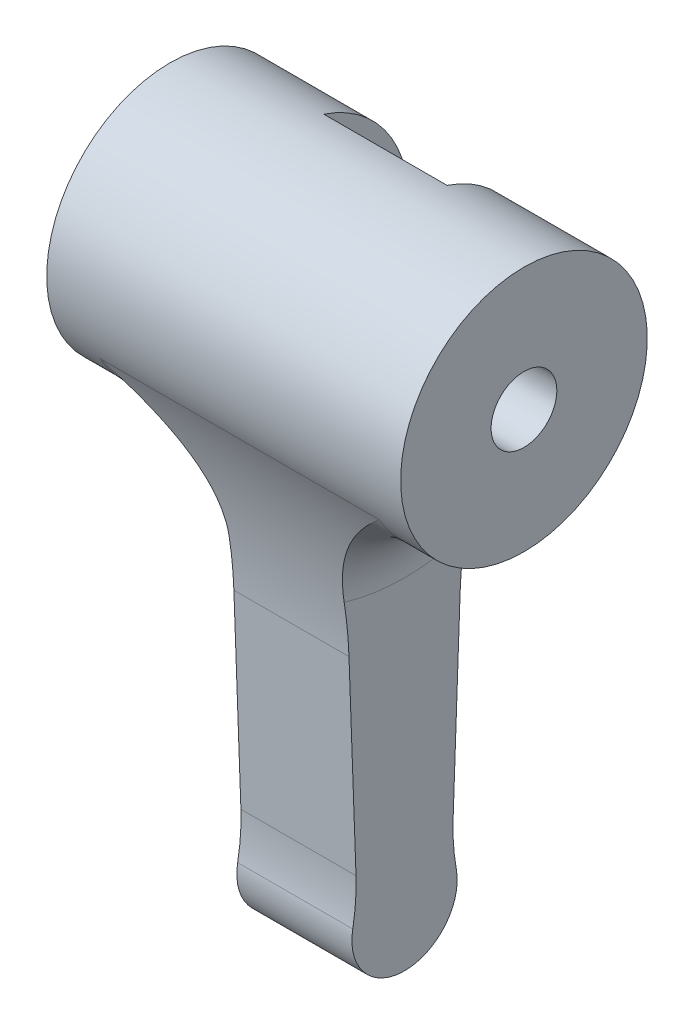
ISO-10303-21;
HEADER;
FILE_DESCRIPTION(('STEP AP214'),'2;1');
FILE_NAME('part.step','',(''),(''),'','','');
FILE_SCHEMA(('AUTOMOTIVE_DESIGN { 1 0 10303 214 1 1 1 1 }'));
ENDSEC;
DATA;
#1=APPLICATION_CONTEXT('core data for automotive mechanical design processes');
#2=APPLICATION_PROTOCOL_DEFINITION('international standard','automotive_design',2000,#1);
#3=PRODUCT_CONTEXT('',#1,'mechanical');
#4=PRODUCT('Part','Part','',(#3));
#5=PRODUCT_RELATED_PRODUCT_CATEGORY('part','',(#4));
#6=PRODUCT_DEFINITION_FORMATION('','',#4);
#7=PRODUCT_DEFINITION_CONTEXT('part definition',#1,'design');
#8=PRODUCT_DEFINITION('design','',#6,#7);
#9=PRODUCT_DEFINITION_SHAPE('','',#8);
#10=(LENGTH_UNIT() NAMED_UNIT(*) SI_UNIT(.MILLI.,.METRE.));
#11=(NAMED_UNIT(*) PLANE_ANGLE_UNIT() SI_UNIT($,.RADIAN.));
#12=(NAMED_UNIT(*) SI_UNIT($,.STERADIAN.) SOLID_ANGLE_UNIT());
#13=UNCERTAINTY_MEASURE_WITH_UNIT(LENGTH_MEASURE(1.E-05),#10,'distance_accuracy_value','');
#14=(GEOMETRIC_REPRESENTATION_CONTEXT(3) GLOBAL_UNCERTAINTY_ASSIGNED_CONTEXT((#13)) GLOBAL_UNIT_ASSIGNED_CONTEXT((#10,
#11,#12)) REPRESENTATION_CONTEXT('',''));
#15=CARTESIAN_POINT('',(0.,0.,0.));
#16=DIRECTION('',(0.,0.,1.));
#17=DIRECTION('',(1.,0.,0.));
#18=AXIS2_PLACEMENT_3D('',#15,#16,#17);
#19=CARTESIAN_POINT('',(-1.4,0.,0.));
#20=DIRECTION('',(1.,0.,0.));
#21=DIRECTION('',(0.,0.,-1.));
#22=AXIS2_PLACEMENT_3D('',#19,#20,#21);
#23=PLANE('',#22);
#24=CARTESIAN_POINT('',(-1.4,5.65271213373792,11.3451283264141));
#25=DIRECTION('',(-1.,0.,0.));
#26=DIRECTION('',(0.,0.,-1.));
#27=AXIS2_PLACEMENT_3D('',#24,#25,#26);
#28=CIRCLE('',#27,10.);
#29=CARTESIAN_POINT('',(-1.4,7.22060634206259,1.46880776906567));
#30=VERTEX_POINT('',#29);
#31=CARTESIAN_POINT('',(-1.4,6.01587936022863,1.35172502395482));
#32=VERTEX_POINT('',#31);
#33=EDGE_CURVE('E287',#30,#32,#28,.T.);
#34=ORIENTED_EDGE('',*,*,#33,.F.);
#35=CARTESIAN_POINT('',(-1.4,12.,0.));
#36=DIRECTION('',(1.,0.,0.));
#37=DIRECTION('',(0.,0.,-1.));
#38=AXIS2_PLACEMENT_3D('',#35,#36,#37);
#39=CIRCLE('',#38,5.);
#40=CARTESIAN_POINT('',(-1.4,7.22060634206259,-1.46880776906567));
#41=VERTEX_POINT('',#40);
#42=EDGE_CURVE('E354',#30,#41,#39,.T.);
#43=ORIENTED_EDGE('',*,*,#42,.T.);
#44=CARTESIAN_POINT('',(-1.4,5.65271213373792,-11.3451283264141));
#45=DIRECTION('',(-1.,0.,0.));
#46=DIRECTION('',(0.,0.,1.));
#47=AXIS2_PLACEMENT_3D('',#44,#45,#46);
#48=CIRCLE('',#47,10.);
#49=CARTESIAN_POINT('',(-1.4,6.0158793602286,-1.35172502395481));
#50=VERTEX_POINT('',#49);
#51=EDGE_CURVE('E283',#50,#41,#48,.T.);
#52=ORIENTED_EDGE('',*,*,#51,.F.);
#53=DIRECTION('',(0.,0.999340330245923,-0.0363167226490681));
#54=VECTOR('',#53,1.);
#55=CARTESIAN_POINT('',(-1.4,6.0158793602286,-1.35172502395481));
#56=LINE('',#55,#54);
#57=CARTESIAN_POINT('',(-1.4,1.31502149827825,-1.18089257977322));
#58=VERTEX_POINT('',#57);
#59=EDGE_CURVE('E279',#58,#50,#56,.T.);
#60=ORIENTED_EDGE('',*,*,#59,.F.);
#61=CARTESIAN_POINT('',(-1.4,1.13343788503291,-6.17759423100284));
#62=DIRECTION('',(-1.,0.,0.));
#63=DIRECTION('',(0.,0.,1.));
#64=AXIS2_PLACEMENT_3D('',#61,#62,#63);
#65=CIRCLE('',#64,5.);
#66=CARTESIAN_POINT('',(-1.4,0.231121587045055,-1.2596856004582));
#67=VERTEX_POINT('',#66);
#68=EDGE_CURVE('E275',#67,#58,#65,.T.);
#69=ORIENTED_EDGE('',*,*,#68,.F.);
#70=CARTESIAN_POINT('',(-1.4,0.,0.));
#71=DIRECTION('',(1.,0.,0.));
#72=DIRECTION('',(0.,0.,-1.));
#73=AXIS2_PLACEMENT_3D('',#70,#71,#72);
#74=CIRCLE('',#73,1.28071269221475);
#75=CARTESIAN_POINT('',(-1.4,0.231121587045048,1.2596856004582));
#76=VERTEX_POINT('',#75);
#77=EDGE_CURVE('E271',#76,#67,#74,.T.);
#78=ORIENTED_EDGE('',*,*,#77,.F.);
#79=CARTESIAN_POINT('',(-1.4,1.13343788503291,6.17759423100284));
#80=DIRECTION('',(-1.,0.,0.));
#81=DIRECTION('',(0.,0.,-1.));
#82=AXIS2_PLACEMENT_3D('',#79,#80,#81);
#83=CIRCLE('',#82,5.);
#84=CARTESIAN_POINT('',(-1.4,1.31502149827826,1.18089257977323));
#85=VERTEX_POINT('',#84);
#86=EDGE_CURVE('E294',#85,#76,#83,.T.);
#87=ORIENTED_EDGE('',*,*,#86,.F.);
#88=DIRECTION('',(0.,-0.999340330245923,-0.0363167226490693));
#89=VECTOR('',#88,1.);
#90=CARTESIAN_POINT('',(-1.4,6.01587936022863,1.35172502395482));
#91=LINE('',#90,#89);
#92=EDGE_CURVE('E290',#32,#85,#91,.T.);
#93=ORIENTED_EDGE('',*,*,#92,.F.);
#94=EDGE_LOOP('',(#34,#43,#52,#60,#69,#78,#87,#93));
#95=FACE_BOUND('',#94,.T.);
#96=ADVANCED_FACE('F41',(#95),#23,.F.);
#97=CARTESIAN_POINT('',(1.4,0.,0.));
#98=DIRECTION('',(1.,0.,0.));
#99=DIRECTION('',(0.,0.,-1.));
#100=AXIS2_PLACEMENT_3D('',#97,#98,#99);
#101=PLANE('',#100);
#102=CARTESIAN_POINT('',(1.4,5.65271213373792,-11.3451283264141));
#103=DIRECTION('',(-1.,0.,0.));
#104=DIRECTION('',(0.,0.,1.));
#105=AXIS2_PLACEMENT_3D('',#102,#103,#104);
#106=CIRCLE('',#105,10.);
#107=CARTESIAN_POINT('',(1.4,6.0158793602286,-1.35172502395481));
#108=VERTEX_POINT('',#107);
#109=CARTESIAN_POINT('',(1.4,7.22060634206259,-1.46880776906567));
#110=VERTEX_POINT('',#109);
#111=EDGE_CURVE('E256',#108,#110,#106,.T.);
#112=ORIENTED_EDGE('',*,*,#111,.T.);
#113=CARTESIAN_POINT('',(1.4,12.,0.));
#114=DIRECTION('',(1.,0.,0.));
#115=DIRECTION('',(0.,0.,-1.));
#116=AXIS2_PLACEMENT_3D('',#113,#114,#115);
#117=CIRCLE('',#116,5.);
#118=CARTESIAN_POINT('',(1.4,7.22060634206259,1.46880776906567));
#119=VERTEX_POINT('',#118);
#120=EDGE_CURVE('E357',#110,#119,#117,.F.);
#121=ORIENTED_EDGE('',*,*,#120,.T.);
#122=CARTESIAN_POINT('',(1.4,5.65271213373792,11.3451283264141));
#123=DIRECTION('',(-1.,0.,0.));
#124=DIRECTION('',(0.,0.,-1.));
#125=AXIS2_PLACEMENT_3D('',#122,#123,#124);
#126=CIRCLE('',#125,10.);
#127=CARTESIAN_POINT('',(1.4,6.01587936022863,1.35172502395482));
#128=VERTEX_POINT('',#127);
#129=EDGE_CURVE('E260',#119,#128,#126,.T.);
#130=ORIENTED_EDGE('',*,*,#129,.T.);
#131=DIRECTION('',(0.,-0.999340330245923,-0.0363167226490693));
#132=VECTOR('',#131,1.);
#133=CARTESIAN_POINT('',(1.4,6.01587936022863,1.35172502395482));
#134=LINE('',#133,#132);
#135=CARTESIAN_POINT('',(1.4,1.31502149827826,1.18089257977323));
#136=VERTEX_POINT('',#135);
#137=EDGE_CURVE('E263',#128,#136,#134,.T.);
#138=ORIENTED_EDGE('',*,*,#137,.T.);
#139=CARTESIAN_POINT('',(1.4,1.13343788503291,6.17759423100284));
#140=DIRECTION('',(-1.,0.,0.));
#141=DIRECTION('',(0.,0.,-1.));
#142=AXIS2_PLACEMENT_3D('',#139,#140,#141);
#143=CIRCLE('',#142,5.);
#144=CARTESIAN_POINT('',(1.4,0.231121587045048,1.2596856004582));
#145=VERTEX_POINT('',#144);
#146=EDGE_CURVE('E267',#136,#145,#143,.T.);
#147=ORIENTED_EDGE('',*,*,#146,.T.);
#148=CARTESIAN_POINT('',(1.4,0.,0.));
#149=DIRECTION('',(1.,0.,0.));
#150=DIRECTION('',(0.,0.,-1.));
#151=AXIS2_PLACEMENT_3D('',#148,#149,#150);
#152=CIRCLE('',#151,1.28071269221475);
#153=CARTESIAN_POINT('',(1.4,0.231121587045055,-1.2596856004582));
#154=VERTEX_POINT('',#153);
#155=EDGE_CURVE('E244',#145,#154,#152,.T.);
#156=ORIENTED_EDGE('',*,*,#155,.T.);
#157=CARTESIAN_POINT('',(1.4,1.13343788503291,-6.17759423100284));
#158=DIRECTION('',(-1.,0.,0.));
#159=DIRECTION('',(0.,0.,1.));
#160=AXIS2_PLACEMENT_3D('',#157,#158,#159);
#161=CIRCLE('',#160,5.);
#162=CARTESIAN_POINT('',(1.4,1.31502149827825,-1.18089257977322));
#163=VERTEX_POINT('',#162);
#164=EDGE_CURVE('E248',#154,#163,#161,.T.);
#165=ORIENTED_EDGE('',*,*,#164,.T.);
#166=DIRECTION('',(0.,0.999340330245923,-0.0363167226490681));
#167=VECTOR('',#166,1.);
#168=CARTESIAN_POINT('',(1.4,6.0158793602286,-1.35172502395481));
#169=LINE('',#168,#167);
#170=EDGE_CURVE('E252',#163,#108,#169,.T.);
#171=ORIENTED_EDGE('',*,*,#170,.T.);
#172=EDGE_LOOP('',(#112,#121,#130,#138,#147,#156,#165,#171));
#173=FACE_BOUND('',#172,.T.);
#174=ADVANCED_FACE('F416',(#173),#101,.T.);
#175=CARTESIAN_POINT('',(-1.4,0.,0.));
#176=DIRECTION('',(1.,0.,0.));
#177=DIRECTION('',(0.,0.,-1.));
#178=AXIS2_PLACEMENT_3D('',#175,#176,#177);
#179=CYLINDRICAL_SURFACE('',#178,1.28071269221475);
#180=DIRECTION('',(1.,0.,0.));
#181=VECTOR('',#180,1.);
#182=CARTESIAN_POINT('',(-1.4,0.231121587045055,-1.2596856004582));
#183=LINE('',#182,#181);
#184=EDGE_CURVE('E298',#67,#154,#183,.T.);
#185=ORIENTED_EDGE('',*,*,#184,.T.);
#186=ORIENTED_EDGE('',*,*,#155,.F.);
#187=DIRECTION('',(1.,0.,0.));
#188=VECTOR('',#187,1.);
#189=CARTESIAN_POINT('',(-1.4,0.231121587045048,1.2596856004582));
#190=LINE('',#189,#188);
#191=EDGE_CURVE('E299',#76,#145,#190,.T.);
#192=ORIENTED_EDGE('',*,*,#191,.F.);
#193=ORIENTED_EDGE('',*,*,#77,.T.);
#194=EDGE_LOOP('',(#185,#186,#192,#193));
#195=FACE_BOUND('',#194,.T.);
#196=ADVANCED_FACE('F422',(#195),#179,.T.);
#197=CARTESIAN_POINT('',(-1.4,1.13343788503291,6.17759423100284));
#198=DIRECTION('',(1.,0.,0.));
#199=DIRECTION('',(0.,0.,-1.));
#200=AXIS2_PLACEMENT_3D('',#197,#198,#199);
#201=CYLINDRICAL_SURFACE('',#200,5.);
#202=ORIENTED_EDGE('',*,*,#191,.T.);
#203=ORIENTED_EDGE('',*,*,#146,.F.);
#204=DIRECTION('',(1.,0.,0.));
#205=VECTOR('',#204,1.);
#206=CARTESIAN_POINT('',(-1.4,1.31502149827826,1.18089257977323));
#207=LINE('',#206,#205);
#208=EDGE_CURVE('E302',#85,#136,#207,.T.);
#209=ORIENTED_EDGE('',*,*,#208,.F.);
#210=ORIENTED_EDGE('',*,*,#86,.T.);
#211=EDGE_LOOP('',(#202,#203,#209,#210));
#212=FACE_BOUND('',#211,.T.);
#213=ADVANCED_FACE('F430',(#212),#201,.F.);
#214=CARTESIAN_POINT('',(-1.4,6.01587936022863,1.35172502395482));
#215=DIRECTION('',(0.,-0.0363167226490693,0.999340330245923));
#216=DIRECTION('',(0.,-0.999340330245923,-0.0363167226490693));
#217=AXIS2_PLACEMENT_3D('',#214,#215,#216);
#218=PLANE('',#217);
#219=ORIENTED_EDGE('',*,*,#208,.T.);
#220=ORIENTED_EDGE('',*,*,#137,.F.);
#221=DIRECTION('',(1.,0.,0.));
#222=VECTOR('',#221,1.);
#223=CARTESIAN_POINT('',(-1.4,6.01587936022863,1.35172502395482));
#224=LINE('',#223,#222);
#225=EDGE_CURVE('E305',#32,#128,#224,.T.);
#226=ORIENTED_EDGE('',*,*,#225,.F.);
#227=ORIENTED_EDGE('',*,*,#92,.T.);
#228=EDGE_LOOP('',(#219,#220,#226,#227));
#229=FACE_BOUND('',#228,.T.);
#230=ADVANCED_FACE('F433',(#229),#218,.T.);
#231=CARTESIAN_POINT('',(-1.4,5.65271213373792,11.3451283264141));
#232=DIRECTION('',(1.,0.,0.));
#233=DIRECTION('',(0.,0.,-1.));
#234=AXIS2_PLACEMENT_3D('',#231,#232,#233);
#235=CYLINDRICAL_SURFACE('',#234,10.);
#236=ORIENTED_EDGE('',*,*,#225,.T.);
#237=ORIENTED_EDGE('',*,*,#129,.F.);
#238=CARTESIAN_POINT('',(1.4,7.22060634206259,1.46880776906567));
#239=CARTESIAN_POINT('',(1.39998456392854,7.30573187153586,1.48230897744977));
#240=CARTESIAN_POINT('',(1.40449054118551,7.3906006001174,1.4969226042818));
#241=CARTESIAN_POINT('',(1.42174460169429,7.55894375459993,1.52812646952778));
#242=CARTESIAN_POINT('',(1.43447441023312,7.64242085204527,1.54471225895342));
#243=CARTESIAN_POINT('',(1.46713944063035,7.80626506619332,1.57941590879311));
#244=CARTESIAN_POINT('',(1.48696553914181,7.88665989993504,1.59750754298956));
#245=CARTESIAN_POINT('',(1.53305912652209,8.04523894062785,1.63521244577628));
#246=CARTESIAN_POINT('',(1.55933079868567,8.12342167498424,1.65482669689845));
#247=CARTESIAN_POINT('',(1.66806009991315,8.41076535108465,1.73053374783954));
#248=CARTESIAN_POINT('',(1.76895885411697,8.61199493027745,1.79091157244589));
#249=CARTESIAN_POINT('',(1.94158848996649,8.89937446228686,1.88629435995976));
#250=CARTESIAN_POINT('',(2.00294683461814,8.99307783326299,1.91902203031715));
#251=CARTESIAN_POINT('',(2.13138239507497,9.17598348355227,1.98585502891483));
#252=CARTESIAN_POINT('',(2.19845824629666,9.26518682883034,2.0199600274147));
#253=CARTESIAN_POINT('',(2.40005750696951,9.51884800748077,2.12096257750806));
#254=CARTESIAN_POINT('',(2.54043992983547,9.67796157952128,2.18947360675582));
#255=CARTESIAN_POINT('',(2.82977111669265,9.98520405857443,2.33080342910772));
#256=CARTESIAN_POINT('',(2.97870200740079,10.1333545013522,2.40361324275461));
#257=CARTESIAN_POINT('',(3.21692613091237,10.3628740982275,2.5233708503079));
#258=CARTESIAN_POINT('',(3.30518353843747,10.4463229115622,2.56843834774253));
#259=CARTESIAN_POINT('',(3.39563564223604,10.5311495683802,2.61581829241981));
#260=CARTESIAN_POINT('',(3.39781782122276,10.5331956162859,2.61696205577527));
#261=CARTESIAN_POINT('',(3.4,10.5352412616318,2.61810653686478));
#262=B_SPLINE_CURVE_WITH_KNOTS('',3,(#238,#239,#240,#241,#242,#243,#244,#245,#246,#247,#248,
#249,#250,#251,#252,#253,#254,#255,#256,#257,#258,#259,#260,#261),.UNSPECIFIED.,.F.,.F.,(4,2,2,
2,2,2,2,2,2,2,2,4),(0.,0.258326731426767,0.516081383552399,0.770031639543701,1.02414715191671,
1.7188466840079,2.0688078706337,2.41868576548898,3.08677793052319,3.75352080850704,
4.14215670293773,4.15176439248419),.UNSPECIFIED.);
#263=CARTESIAN_POINT('',(3.4,10.5352412616318,2.61810653686478));
#264=VERTEX_POINT('',#263);
#265=EDGE_CURVE('E472',#119,#264,#262,.T.);
#266=ORIENTED_EDGE('',*,*,#265,.T.);
#267=DIRECTION('',(1.,0.,0.));
#268=VECTOR('',#267,1.);
#269=CARTESIAN_POINT('',(-1.4,10.5352412616318,2.61810653686478));
#270=LINE('',#269,#268);
#271=CARTESIAN_POINT('',(-3.4,10.5352412616318,2.61810653686478));
#272=VERTEX_POINT('',#271);
#273=EDGE_CURVE('E309',#272,#264,#270,.T.);
#274=ORIENTED_EDGE('',*,*,#273,.F.);
#275=CARTESIAN_POINT('',(-1.4,7.22060634206259,1.46880776906568));
#276=CARTESIAN_POINT('',(-1.39998456392854,7.30573187153589,1.48230897744978));
#277=CARTESIAN_POINT('',(-1.40449054118552,7.39060060011746,1.49692260428181));
#278=CARTESIAN_POINT('',(-1.4217446016943,7.55894375460005,1.5281264695278));
#279=CARTESIAN_POINT('',(-1.43447441023314,7.64242085204541,1.54471225895345));
#280=CARTESIAN_POINT('',(-1.46713944063039,7.80626506619347,1.57941590879314));
#281=CARTESIAN_POINT('',(-1.48696553914185,7.88665989993515,1.59750754298959));
#282=CARTESIAN_POINT('',(-1.53305912652211,8.0452389406279,1.63521244577629));
#283=CARTESIAN_POINT('',(-1.55933079868568,8.12342167498427,1.65482669689845));
#284=CARTESIAN_POINT('',(-1.66806009991313,8.41076535108461,1.73053374783954));
#285=CARTESIAN_POINT('',(-1.76895885411692,8.61199493027738,1.79091157244588));
#286=CARTESIAN_POINT('',(-1.94158848996644,8.89937446228678,1.88629435995973));
#287=CARTESIAN_POINT('',(-2.00294683461811,8.99307783326292,1.91902203031712));
#288=CARTESIAN_POINT('',(-2.13138239507494,9.17598348355224,1.98585502891482));
#289=CARTESIAN_POINT('',(-2.19845824629662,9.26518682883035,2.01996002741471));
#290=CARTESIAN_POINT('',(-2.40005750696958,9.51884800748074,2.12096257750804));
#291=CARTESIAN_POINT('',(-2.5404399298358,9.67796157952107,2.1894736067557));
#292=CARTESIAN_POINT('',(-2.82977111669237,9.98520405857471,2.33080342910788));
#293=CARTESIAN_POINT('',(-2.97870200739966,10.1333545013532,2.40361324275514));
#294=CARTESIAN_POINT('',(-3.21692613091304,10.362874098227,2.5233708503076));
#295=CARTESIAN_POINT('',(-3.30518353843949,10.4463229115605,2.56843834774162));
#296=CARTESIAN_POINT('',(-3.39563564223613,10.5311495683802,2.61581829241977));
#297=CARTESIAN_POINT('',(-3.39781782122281,10.5331956162858,2.61696205577525));
#298=CARTESIAN_POINT('',(-3.4,10.5352412616318,2.61810653686478));
#299=B_SPLINE_CURVE_WITH_KNOTS('',3,(#275,#276,#277,#278,#279,#280,#281,#282,#283,#284,#285,
#286,#287,#288,#289,#290,#291,#292,#293,#294,#295,#296,#297,#298),.UNSPECIFIED.,.F.,.F.,(4,2,2,
2,2,2,2,2,2,2,2,4),(0.,0.258326731426855,0.516081383552577,0.770031639543793,1.02414715191671,
1.71884668400776,2.06880787063364,2.41868576548897,3.08677793052326,3.75352080850704,
4.14215670293773,4.15176439248419),.UNSPECIFIED.);
#300=EDGE_CURVE('E360',#272,#30,#299,.F.);
#301=ORIENTED_EDGE('',*,*,#300,.T.);
#302=ORIENTED_EDGE('',*,*,#33,.T.);
#303=EDGE_LOOP('',(#236,#237,#266,#274,#301,#302));
#304=FACE_BOUND('',#303,.T.);
#305=ADVANCED_FACE('F376',(#304),#235,.F.);
#306=CARTESIAN_POINT('',(-1.4,12.,0.));
#307=DIRECTION('',(1.,0.,0.));
#308=DIRECTION('',(0.,0.,-1.));
#309=AXIS2_PLACEMENT_3D('',#306,#307,#308);
#310=CYLINDRICAL_SURFACE('',#309,3.);
#311=CARTESIAN_POINT('',(-1.5,12.,0.));
#312=DIRECTION('',(1.,0.,0.));
#313=DIRECTION('',(0.,1.,0.));
#314=AXIS2_PLACEMENT_3D('',#311,#312,#313);
#315=CIRCLE('',#314,3.);
#316=CARTESIAN_POINT('',(-1.5,14.8502021758313,-0.936134369033869));
#317=VERTEX_POINT('',#316);
#318=CARTESIAN_POINT('',(-1.5,10.0622691573281,-2.29023998335503));
#319=VERTEX_POINT('',#318);
#320=EDGE_CURVE('E331',#317,#319,#315,.F.);
#321=ORIENTED_EDGE('',*,*,#320,.T.);
#322=DIRECTION('',(1.,0.,0.));
#323=VECTOR('',#322,1.);
#324=CARTESIAN_POINT('',(-1.4,10.0622691573281,-2.29023998335503));
#325=LINE('',#324,#323);
#326=CARTESIAN_POINT('',(-3.4,10.0622691573281,-2.29023998335503));
#327=VERTEX_POINT('',#326);
#328=EDGE_CURVE('E402',#319,#327,#325,.F.);
#329=ORIENTED_EDGE('',*,*,#328,.T.);
#330=CARTESIAN_POINT('',(-3.4,12.,0.));
#331=DIRECTION('',(1.,0.,0.));
#332=DIRECTION('',(0.,0.,-1.));
#333=AXIS2_PLACEMENT_3D('',#330,#331,#332);
#334=CIRCLE('',#333,3.);
#335=CARTESIAN_POINT('',(-3.4,9.13236380523755,-0.881284661439404));
#336=VERTEX_POINT('',#335);
#337=EDGE_CURVE('E346',#327,#336,#334,.F.);
#338=ORIENTED_EDGE('',*,*,#337,.T.);
#339=CARTESIAN_POINT('',(-3.4,12.,0.));
#340=DIRECTION('',(1.,0.,0.));
#341=DIRECTION('',(0.,0.,-1.));
#342=AXIS2_PLACEMENT_3D('',#339,#340,#341);
#343=CIRCLE('',#342,3.);
#344=EDGE_CURVE('E350',#336,#272,#343,.F.);
#345=ORIENTED_EDGE('',*,*,#344,.T.);
#346=ORIENTED_EDGE('',*,*,#273,.T.);
#347=CARTESIAN_POINT('',(3.4,12.,0.));
#348=DIRECTION('',(1.,0.,0.));
#349=DIRECTION('',(0.,0.,-1.));
#350=AXIS2_PLACEMENT_3D('',#347,#348,#349);
#351=CIRCLE('',#350,3.);
#352=CARTESIAN_POINT('',(3.4,9.13236380523755,-0.881284661439404));
#353=VERTEX_POINT('',#352);
#354=EDGE_CURVE('E343',#264,#353,#351,.T.);
#355=ORIENTED_EDGE('',*,*,#354,.T.);
#356=CARTESIAN_POINT('',(3.4,12.,0.));
#357=DIRECTION('',(1.,0.,0.));
#358=DIRECTION('',(0.,0.,-1.));
#359=AXIS2_PLACEMENT_3D('',#356,#357,#358);
#360=CIRCLE('',#359,3.);
#361=CARTESIAN_POINT('',(3.4,10.0622691573281,-2.29023998335503));
#362=VERTEX_POINT('',#361);
#363=EDGE_CURVE('E335',#353,#362,#360,.T.);
#364=ORIENTED_EDGE('',*,*,#363,.T.);
#365=DIRECTION('',(1.,0.,0.));
#366=VECTOR('',#365,1.);
#367=CARTESIAN_POINT('',(-1.4,10.0622691573281,-2.29023998335503));
#368=LINE('',#367,#366);
#369=CARTESIAN_POINT('',(1.5,10.0622691573281,-2.29023998335503));
#370=VERTEX_POINT('',#369);
#371=EDGE_CURVE('E476',#362,#370,#368,.F.);
#372=ORIENTED_EDGE('',*,*,#371,.T.);
#373=CARTESIAN_POINT('',(1.5,12.,0.));
#374=DIRECTION('',(1.,0.,0.));
#375=DIRECTION('',(0.,1.,0.));
#376=AXIS2_PLACEMENT_3D('',#373,#374,#375);
#377=CIRCLE('',#376,3.);
#378=CARTESIAN_POINT('',(1.5,14.8502021758313,-0.93613436903387));
#379=VERTEX_POINT('',#378);
#380=EDGE_CURVE('E324',#379,#370,#377,.F.);
#381=ORIENTED_EDGE('',*,*,#380,.F.);
#382=DIRECTION('',(1.,0.,0.));
#383=VECTOR('',#382,1.);
#384=CARTESIAN_POINT('',(-1.4,14.8502021758313,-0.93613436903387));
#385=LINE('',#384,#383);
#386=EDGE_CURVE('E328',#317,#379,#385,.T.);
#387=ORIENTED_EDGE('',*,*,#386,.F.);
#388=EDGE_LOOP('',(#321,#329,#338,#345,#346,#355,#364,#372,#381,#387));
#389=FACE_BOUND('',#388,.T.);
#390=CARTESIAN_POINT('',(4.30499999999999,12.,0.));
#391=DIRECTION('',(1.,0.,0.));
#392=DIRECTION('',(0.,1.,0.));
#393=AXIS2_PLACEMENT_3D('',#390,#391,#392);
#394=CIRCLE('',#393,3.);
#395=CARTESIAN_POINT('',(4.30499999999999,15.,0.));
#396=VERTEX_POINT('',#395);
#397=EDGE_CURVE('E240',#396,#396,#394,.T.);
#398=ORIENTED_EDGE('',*,*,#397,.F.);
#399=EDGE_LOOP('',(#398));
#400=FACE_BOUND('',#399,.T.);
#401=CARTESIAN_POINT('',(-4.305,12.,0.));
#402=DIRECTION('',(1.,0.,0.));
#403=DIRECTION('',(0.,1.,0.));
#404=AXIS2_PLACEMENT_3D('',#401,#402,#403);
#405=CIRCLE('',#404,3.);
#406=CARTESIAN_POINT('',(-4.305,15.,0.));
#407=VERTEX_POINT('',#406);
#408=EDGE_CURVE('E236',#407,#407,#405,.F.);
#409=ORIENTED_EDGE('',*,*,#408,.F.);
#410=EDGE_LOOP('',(#409));
#411=FACE_BOUND('',#410,.T.);
#412=ADVANCED_FACE('F440',(#389,#400,#411),#310,.T.);
#413=CARTESIAN_POINT('',(-1.4,5.65271213373792,-11.3451283264141));
#414=DIRECTION('',(1.,0.,0.));
#415=DIRECTION('',(0.,0.,-1.));
#416=AXIS2_PLACEMENT_3D('',#413,#414,#415);
#417=CYLINDRICAL_SURFACE('',#416,10.);
#418=DIRECTION('',(1.,0.,0.));
#419=VECTOR('',#418,1.);
#420=CARTESIAN_POINT('',(-1.4,8.6931869476851,-1.81855953666855));
#421=LINE('',#420,#419);
#422=CARTESIAN_POINT('',(1.81992718458895,8.6931869476851,-1.81855953666855));
#423=VERTEX_POINT('',#422);
#424=CARTESIAN_POINT('',(1.5,8.6931869476851,-1.81855953666855));
#425=VERTEX_POINT('',#424);
#426=EDGE_CURVE('E320',#423,#425,#421,.F.);
#427=ORIENTED_EDGE('',*,*,#426,.F.);
#428=CARTESIAN_POINT('',(1.4,7.22060634206259,-1.46880776906567));
#429=CARTESIAN_POINT('',(1.39998371805971,7.30611086569633,-1.48236873549307));
#430=CARTESIAN_POINT('',(1.40453040191473,7.39135736322881,-1.49705273259996));
#431=CARTESIAN_POINT('',(1.42193751238009,7.56045516714745,-1.52841678798536));
#432=CARTESIAN_POINT('',(1.43478088633395,7.64430897421922,-1.54509269500387));
#433=CARTESIAN_POINT('',(1.46758214132755,7.8081330103768,-1.57983117391863));
#434=CARTESIAN_POINT('',(1.48736412150886,7.88814817954695,-1.59785149457514));
#435=CARTESIAN_POINT('',(1.53330925574812,8.04598071013471,-1.63539887465752));
#436=CARTESIAN_POINT('',(1.55947516688191,8.12379710570594,-1.6549265825923));
#437=CARTESIAN_POINT('',(1.62773918358433,8.30421577077511,-1.70245958733139));
#438=CARTESIAN_POINT('',(1.67219329778139,8.40578319750697,-1.73100866674729));
#439=CARTESIAN_POINT('',(1.76967524589897,8.60419790403613,-1.79005313207056));
#440=CARTESIAN_POINT('',(1.82271184025912,8.70104022788658,-1.82055048719416));
#441=CARTESIAN_POINT('',(1.9376552329757,8.89324695444257,-1.88417967473506));
#442=CARTESIAN_POINT('',(1.99980363156862,8.98844711922839,-1.91736596384039));
#443=CARTESIAN_POINT('',(2.12982865338963,9.17391905470598,-1.98506622436386));
#444=CARTESIAN_POINT('',(2.19768774360355,9.26420460292634,-2.01957596683881));
#445=CARTESIAN_POINT('',(2.26774822613777,9.35237057095567,-2.05467476117171));
#446=B_SPLINE_CURVE_WITH_KNOTS('',3,(#428,#429,#430,#431,#432,#433,#434,#435,#436,#437,#438,
#439,#440,#441,#442,#443,#444,#445),.UNSPECIFIED.,.F.,.F.,(4,2,2,2,2,2,2,2,4),(0.,
0.259477737357413,0.518423845040807,0.771230480932596,1.02414649218062,1.36707147988085,
1.71034873710945,2.06538396073685,2.41936636123202),.UNSPECIFIED.);
#447=EDGE_CURVE('E469',#423,#110,#446,.F.);
#448=ORIENTED_EDGE('',*,*,#447,.T.);
#449=ORIENTED_EDGE('',*,*,#111,.F.);
#450=DIRECTION('',(1.,0.,0.));
#451=VECTOR('',#450,1.);
#452=CARTESIAN_POINT('',(-1.4,6.0158793602286,-1.35172502395481));
#453=LINE('',#452,#451);
#454=EDGE_CURVE('E312',#50,#108,#453,.T.);
#455=ORIENTED_EDGE('',*,*,#454,.F.);
#456=ORIENTED_EDGE('',*,*,#51,.T.);
#457=CARTESIAN_POINT('',(-1.4,7.22060634206259,-1.46880776906567));
#458=CARTESIAN_POINT('',(-1.39998371805971,7.30611086569633,-1.48236873549307));
#459=CARTESIAN_POINT('',(-1.40453040191473,7.39135736322881,-1.49705273259996));
#460=CARTESIAN_POINT('',(-1.42193751238009,7.56045516714745,-1.52841678798536));
#461=CARTESIAN_POINT('',(-1.43478088633395,7.64430897421923,-1.54509269500387));
#462=CARTESIAN_POINT('',(-1.46758214132755,7.8081330103768,-1.57983117391863));
#463=CARTESIAN_POINT('',(-1.48736412150886,7.88814817954695,-1.59785149457514));
#464=CARTESIAN_POINT('',(-1.53330925574812,8.04598071013471,-1.63539887465752));
#465=CARTESIAN_POINT('',(-1.55947516688191,8.12379710570594,-1.6549265825923));
#466=CARTESIAN_POINT('',(-1.62773918358433,8.30421577077511,-1.70245958733139));
#467=CARTESIAN_POINT('',(-1.67219329778139,8.40578319750698,-1.73100866674729));
#468=CARTESIAN_POINT('',(-1.76967524589897,8.60419790403613,-1.79005313207056));
#469=CARTESIAN_POINT('',(-1.82271184025912,8.70104022788658,-1.82055048719416));
#470=CARTESIAN_POINT('',(-1.9376552329757,8.89324695444257,-1.88417967473506));
#471=CARTESIAN_POINT('',(-1.99980363156862,8.98844711922839,-1.91736596384039));
#472=CARTESIAN_POINT('',(-2.12982865338963,9.17391905470598,-1.98506622436386));
#473=CARTESIAN_POINT('',(-2.19768774360355,9.26420460292634,-2.01957596683881));
#474=CARTESIAN_POINT('',(-2.26774822613777,9.35237057095567,-2.05467476117171));
#475=B_SPLINE_CURVE_WITH_KNOTS('',3,(#457,#458,#459,#460,#461,#462,#463,#464,#465,#466,#467,
#468,#469,#470,#471,#472,#473,#474),.UNSPECIFIED.,.F.,.F.,(4,2,2,2,2,2,2,2,4),(0.,
0.259477737357413,0.518423845040808,0.771230480932596,1.02414649218061,1.36707147988085,
1.71034873710945,2.06538396073685,2.41936636123201),.UNSPECIFIED.);
#476=CARTESIAN_POINT('',(-1.81992718458895,8.6931869476851,-1.81855953666855));
#477=VERTEX_POINT('',#476);
#478=EDGE_CURVE('E369',#41,#477,#475,.T.);
#479=ORIENTED_EDGE('',*,*,#478,.T.);
#480=CARTESIAN_POINT('',(-1.5,8.6931869476851,-1.81855953666855));
#481=VERTEX_POINT('',#480);
#482=EDGE_CURVE('E301',#481,#477,#421,.F.);
#483=ORIENTED_EDGE('',*,*,#482,.F.);
#484=EDGE_CURVE('E325',#425,#481,#421,.F.);
#485=ORIENTED_EDGE('',*,*,#484,.F.);
#486=EDGE_LOOP('',(#427,#448,#449,#455,#456,#479,#483,#485));
#487=FACE_BOUND('',#486,.T.);
#488=ADVANCED_FACE('F459',(#487),#417,.F.);
#489=CARTESIAN_POINT('',(-1.4,6.0158793602286,-1.35172502395481));
#490=DIRECTION('',(0.,-0.0363167226490681,-0.999340330245923));
#491=DIRECTION('',(0.,0.999340330245923,-0.0363167226490681));
#492=AXIS2_PLACEMENT_3D('',#489,#490,#491);
#493=PLANE('',#492);
#494=ORIENTED_EDGE('',*,*,#454,.T.);
#495=ORIENTED_EDGE('',*,*,#170,.F.);
#496=DIRECTION('',(1.,0.,0.));
#497=VECTOR('',#496,1.);
#498=CARTESIAN_POINT('',(-1.4,1.31502149827825,-1.18089257977322));
#499=LINE('',#498,#497);
#500=EDGE_CURVE('E315',#58,#163,#499,.T.);
#501=ORIENTED_EDGE('',*,*,#500,.F.);
#502=ORIENTED_EDGE('',*,*,#59,.T.);
#503=EDGE_LOOP('',(#494,#495,#501,#502));
#504=FACE_BOUND('',#503,.T.);
#505=ADVANCED_FACE('F455',(#504),#493,.T.);
#506=CARTESIAN_POINT('',(-1.4,1.13343788503291,-6.17759423100284));
#507=DIRECTION('',(1.,0.,0.));
#508=DIRECTION('',(0.,0.,-1.));
#509=AXIS2_PLACEMENT_3D('',#506,#507,#508);
#510=CYLINDRICAL_SURFACE('',#509,5.);
#511=ORIENTED_EDGE('',*,*,#500,.T.);
#512=ORIENTED_EDGE('',*,*,#164,.F.);
#513=ORIENTED_EDGE('',*,*,#184,.F.);
#514=ORIENTED_EDGE('',*,*,#68,.T.);
#515=EDGE_LOOP('',(#511,#512,#513,#514));
#516=FACE_BOUND('',#515,.T.);
#517=ADVANCED_FACE('F387',(#516),#510,.F.);
#518=CARTESIAN_POINT('',(4.305,12.,0.));
#519=DIRECTION('',(1.,0.,0.));
#520=DIRECTION('',(0.,-0.756793044237079,-0.653654563354663));
#521=AXIS2_PLACEMENT_3D('',#518,#519,#520);
#522=PLANE('',#521);
#523=CARTESIAN_POINT('',(4.30499999999999,12.,0.));
#524=DIRECTION('',(1.,0.,0.));
#525=DIRECTION('',(0.,0.,-1.));
#526=AXIS2_PLACEMENT_3D('',#523,#524,#525);
#527=CIRCLE('',#526,0.8);
#528=CARTESIAN_POINT('',(4.30499999999999,12.,-0.8));
#529=VERTEX_POINT('',#528);
#530=EDGE_CURVE('E535',#529,#529,#527,.T.);
#531=ORIENTED_EDGE('',*,*,#530,.F.);
#532=EDGE_LOOP('',(#531));
#533=FACE_BOUND('',#532,.T.);
#534=ORIENTED_EDGE('',*,*,#397,.T.);
#535=EDGE_LOOP('',(#534));
#536=FACE_BOUND('',#535,.T.);
#537=ADVANCED_FACE('F493',(#533,#536),#522,.T.);
#538=CARTESIAN_POINT('',(-4.305,12.,0.));
#539=DIRECTION('',(1.,0.,0.));
#540=DIRECTION('',(0.,-0.733045343287569,-0.680179773798376));
#541=AXIS2_PLACEMENT_3D('',#538,#539,#540);
#542=PLANE('',#541);
#543=CARTESIAN_POINT('',(-4.305,12.,0.));
#544=DIRECTION('',(1.,0.,0.));
#545=DIRECTION('',(0.,0.,-1.));
#546=AXIS2_PLACEMENT_3D('',#543,#544,#545);
#547=CIRCLE('',#546,0.8);
#548=CARTESIAN_POINT('',(-4.305,12.,-0.8));
#549=VERTEX_POINT('',#548);
#550=EDGE_CURVE('E340',#549,#549,#547,.T.);
#551=ORIENTED_EDGE('',*,*,#550,.T.);
#552=EDGE_LOOP('',(#551));
#553=FACE_BOUND('',#552,.T.);
#554=ORIENTED_EDGE('',*,*,#408,.T.);
#555=EDGE_LOOP('',(#554));
#556=FACE_BOUND('',#555,.T.);
#557=ADVANCED_FACE('F497',(#553,#556),#542,.F.);
#558=CARTESIAN_POINT('',(-12.0838936421907,12.,0.));
#559=DIRECTION('',(1.,0.,0.));
#560=DIRECTION('',(0.,0.,-1.));
#561=AXIS2_PLACEMENT_3D('',#558,#559,#560);
#562=CYLINDRICAL_SURFACE('',#561,2.1);
#563=CARTESIAN_POINT('',(-1.5,12.,0.));
#564=DIRECTION('',(1.,0.,0.));
#565=DIRECTION('',(0.,1.,0.));
#566=AXIS2_PLACEMENT_3D('',#563,#564,#565);
#567=CIRCLE('',#566,2.1);
#568=CARTESIAN_POINT('',(-1.5,10.1352607657259,0.965788583572438));
#569=VERTEX_POINT('',#568);
#570=CARTESIAN_POINT('',(-1.5,13.8645726278742,0.966110198363754));
#571=VERTEX_POINT('',#570);
#572=EDGE_CURVE('E230',#569,#571,#567,.F.);
#573=ORIENTED_EDGE('',*,*,#572,.T.);
#574=DIRECTION('',(1.,0.,0.));
#575=VECTOR('',#574,1.);
#576=CARTESIAN_POINT('',(-12.0838936421907,13.8645726278742,0.966110198363754));
#577=LINE('',#576,#575);
#578=CARTESIAN_POINT('',(1.5,13.8645726278742,0.966110198363754));
#579=VERTEX_POINT('',#578);
#580=EDGE_CURVE('E203',#571,#579,#577,.T.);
#581=ORIENTED_EDGE('',*,*,#580,.T.);
#582=CARTESIAN_POINT('',(1.5,12.,0.));
#583=DIRECTION('',(1.,0.,0.));
#584=DIRECTION('',(0.,1.,0.));
#585=AXIS2_PLACEMENT_3D('',#582,#583,#584);
#586=CIRCLE('',#585,2.1);
#587=CARTESIAN_POINT('',(1.5,10.1352607657259,0.965788583572438));
#588=VERTEX_POINT('',#587);
#589=EDGE_CURVE('E210',#579,#588,#586,.T.);
#590=ORIENTED_EDGE('',*,*,#589,.T.);
#591=DIRECTION('',(1.,0.,0.));
#592=VECTOR('',#591,1.);
#593=CARTESIAN_POINT('',(-12.0838936421907,10.1352607657259,0.965788583572438));
#594=LINE('',#593,#592);
#595=EDGE_CURVE('E198',#569,#588,#594,.T.);
#596=ORIENTED_EDGE('',*,*,#595,.F.);
#597=EDGE_LOOP('',(#573,#581,#590,#596));
#598=FACE_BOUND('',#597,.T.);
#599=ADVANCED_FACE('F215',(#598),#562,.F.);
#600=CARTESIAN_POINT('',(-12.0838936421907,13.8645726278742,0.966110198363754));
#601=DIRECTION('',(0.,0.887891727559123,0.460052475411312));
#602=DIRECTION('',(0.,-0.460052475411312,0.887891727559123));
#603=AXIS2_PLACEMENT_3D('',#600,#601,#602);
#604=PLANE('',#603);
#605=ORIENTED_EDGE('',*,*,#386,.T.);
#606=DIRECTION('',(0.,-0.460052475411312,0.887891727559123));
#607=VECTOR('',#606,1.);
#608=CARTESIAN_POINT('',(1.5,13.8645726278742,0.966110198363753));
#609=LINE('',#608,#607);
#610=EDGE_CURVE('E218',#379,#579,#609,.T.);
#611=ORIENTED_EDGE('',*,*,#610,.T.);
#612=ORIENTED_EDGE('',*,*,#580,.F.);
#613=DIRECTION('',(0.,0.460052475411312,-0.887891727559123));
#614=VECTOR('',#613,1.);
#615=CARTESIAN_POINT('',(-1.5,13.8645726278742,0.966110198363755));
#616=LINE('',#615,#614);
#617=EDGE_CURVE('E226',#571,#317,#616,.T.);
#618=ORIENTED_EDGE('',*,*,#617,.T.);
#619=EDGE_LOOP('',(#605,#611,#612,#618));
#620=FACE_BOUND('',#619,.T.);
#621=ADVANCED_FACE('F509',(#620),#604,.F.);
#622=CARTESIAN_POINT('',(-12.0838936421907,10.1352607657259,0.965788583572438));
#623=DIRECTION('',(0.,-0.887971063940046,0.459899325510684));
#624=DIRECTION('',(0.,-0.459899325510684,-0.887971063940046));
#625=AXIS2_PLACEMENT_3D('',#622,#623,#624);
#626=PLANE('',#625);
#627=ORIENTED_EDGE('',*,*,#484,.T.);
#628=DIRECTION('',(0.,0.459899325510684,0.887971063940046));
#629=VECTOR('',#628,1.);
#630=CARTESIAN_POINT('',(-1.5,10.1352607657259,0.965788583572438));
#631=LINE('',#630,#629);
#632=EDGE_CURVE('E66',#481,#569,#631,.T.);
#633=ORIENTED_EDGE('',*,*,#632,.T.);
#634=ORIENTED_EDGE('',*,*,#595,.T.);
#635=DIRECTION('',(0.,-0.459899325510684,-0.887971063940046));
#636=VECTOR('',#635,1.);
#637=CARTESIAN_POINT('',(1.5,10.1352607657259,0.965788583572438));
#638=LINE('',#637,#636);
#639=EDGE_CURVE('E75',#588,#425,#638,.T.);
#640=ORIENTED_EDGE('',*,*,#639,.T.);
#641=EDGE_LOOP('',(#627,#633,#634,#640));
#642=FACE_BOUND('',#641,.T.);
#643=ADVANCED_FACE('F199',(#642),#626,.F.);
#644=CARTESIAN_POINT('',(-1.5,12.,0.));
#645=DIRECTION('',(1.,0.,0.));
#646=DIRECTION('',(0.,-0.991433601145435,-0.130611693656408));
#647=AXIS2_PLACEMENT_3D('',#644,#645,#646);
#648=PLANE('',#647);
#649=CARTESIAN_POINT('',(-1.5,12.,0.));
#650=DIRECTION('',(1.,0.,0.));
#651=DIRECTION('',(0.,1.,0.));
#652=AXIS2_PLACEMENT_3D('',#649,#650,#651);
#653=CIRCLE('',#652,0.8);
#654=CARTESIAN_POINT('',(-1.5,12.8,0.));
#655=VERTEX_POINT('',#654);
#656=EDGE_CURVE('E222',#655,#655,#653,.T.);
#657=ORIENTED_EDGE('',*,*,#656,.F.);
#658=EDGE_LOOP('',(#657));
#659=FACE_BOUND('',#658,.T.);
#660=ORIENTED_EDGE('',*,*,#617,.F.);
#661=ORIENTED_EDGE('',*,*,#572,.F.);
#662=ORIENTED_EDGE('',*,*,#632,.F.);
#663=CARTESIAN_POINT('',(-1.5,8.77044859554684,-3.81706663892505));
#664=DIRECTION('',(1.,0.,0.));
#665=DIRECTION('',(0.,1.,0.));
#666=AXIS2_PLACEMENT_3D('',#663,#664,#665);
#667=CIRCLE('',#666,2.);
#668=EDGE_CURVE('E401',#481,#319,#667,.F.);
#669=ORIENTED_EDGE('',*,*,#668,.T.);
#670=ORIENTED_EDGE('',*,*,#320,.F.);
#671=EDGE_LOOP('',(#660,#661,#662,#669,#670));
#672=FACE_BOUND('',#671,.T.);
#673=ADVANCED_FACE('F512',(#659,#672),#648,.T.);
#674=CARTESIAN_POINT('',(1.5,12.,0.));
#675=DIRECTION('',(1.,0.,0.));
#676=DIRECTION('',(0.,-0.991433601145435,-0.130611693656408));
#677=AXIS2_PLACEMENT_3D('',#674,#675,#676);
#678=PLANE('',#677);
#679=CARTESIAN_POINT('',(1.5,12.,0.));
#680=DIRECTION('',(1.,0.,0.));
#681=DIRECTION('',(0.,1.,0.));
#682=AXIS2_PLACEMENT_3D('',#679,#680,#681);
#683=CIRCLE('',#682,0.8);
#684=CARTESIAN_POINT('',(1.5,12.8,0.));
#685=VERTEX_POINT('',#684);
#686=EDGE_CURVE('E336',#685,#685,#683,.T.);
#687=ORIENTED_EDGE('',*,*,#686,.T.);
#688=EDGE_LOOP('',(#687));
#689=FACE_BOUND('',#688,.T.);
#690=ORIENTED_EDGE('',*,*,#380,.T.);
#691=CARTESIAN_POINT('',(1.5,8.77044859554684,-3.81706663892505));
#692=DIRECTION('',(1.,0.,0.));
#693=DIRECTION('',(0.,1.,0.));
#694=AXIS2_PLACEMENT_3D('',#691,#692,#693);
#695=CIRCLE('',#694,2.);
#696=EDGE_CURVE('E56',#370,#425,#695,.T.);
#697=ORIENTED_EDGE('',*,*,#696,.T.);
#698=ORIENTED_EDGE('',*,*,#639,.F.);
#699=ORIENTED_EDGE('',*,*,#589,.F.);
#700=ORIENTED_EDGE('',*,*,#610,.F.);
#701=EDGE_LOOP('',(#690,#697,#698,#699,#700));
#702=FACE_BOUND('',#701,.T.);
#703=ADVANCED_FACE('F208',(#689,#702),#678,.F.);
#704=CARTESIAN_POINT('',(-4.305,12.,0.));
#705=DIRECTION('',(1.,0.,0.));
#706=DIRECTION('',(0.,0.,-1.));
#707=AXIS2_PLACEMENT_3D('',#704,#705,#706);
#708=CYLINDRICAL_SURFACE('',#707,0.8);
#709=ORIENTED_EDGE('',*,*,#530,.T.);
#710=EDGE_LOOP('',(#709));
#711=FACE_BOUND('',#710,.T.);
#712=ORIENTED_EDGE('',*,*,#686,.F.);
#713=EDGE_LOOP('',(#712));
#714=FACE_BOUND('',#713,.T.);
#715=ADVANCED_FACE('F521',(#711,#714),#708,.F.);
#716=ORIENTED_EDGE('',*,*,#656,.T.);
#717=EDGE_LOOP('',(#716));
#718=FACE_BOUND('',#717,.T.);
#719=ORIENTED_EDGE('',*,*,#550,.F.);
#720=EDGE_LOOP('',(#719));
#721=FACE_BOUND('',#720,.T.);
#722=ADVANCED_FACE('F385',(#718,#721),#708,.F.);
#723=CARTESIAN_POINT('',(-3.4,12.,0.));
#724=DIRECTION('',(1.,0.,0.));
#725=DIRECTION('',(0.,0.,-1.));
#726=AXIS2_PLACEMENT_3D('',#723,#724,#725);
#727=TOROIDAL_SURFACE('',#726,5.,2.);
#728=ORIENTED_EDGE('',*,*,#478,.F.);
#729=ORIENTED_EDGE('',*,*,#42,.F.);
#730=ORIENTED_EDGE('',*,*,#300,.F.);
#731=ORIENTED_EDGE('',*,*,#344,.F.);
#732=ORIENTED_EDGE('',*,*,#337,.F.);
#733=CARTESIAN_POINT('',(-1.81992718458895,8.6931869476851,-1.81855953666855));
#734=CARTESIAN_POINT('',(-1.86905666665572,8.76393863870822,-1.81586211576141));
#735=CARTESIAN_POINT('',(-1.92111531221847,8.83260277356994,-1.81692969873666));
#736=CARTESIAN_POINT('',(-2.02978431178215,8.96550792586729,-1.82548201554165));
#737=CARTESIAN_POINT('',(-2.08638119572724,9.02976105367021,-1.83294835268726));
#738=CARTESIAN_POINT('',(-2.20255449269692,9.15340592523069,-1.85308537992341));
#739=CARTESIAN_POINT('',(-2.26209708673481,9.21283841629529,-1.8657054207347));
#740=CARTESIAN_POINT('',(-2.38385845698899,9.32777273787993,-1.89537066743977));
#741=CARTESIAN_POINT('',(-2.44607880546335,9.38327220706632,-1.91241850354733));
#742=CARTESIAN_POINT('',(-2.5793019237452,9.49636866814489,-1.95239079405715));
#743=CARTESIAN_POINT('',(-2.65052806563799,9.55354614073568,-1.97575078967119));
#744=CARTESIAN_POINT('',(-2.79471729985959,9.66383209821072,-2.02665957761303));
#745=CARTESIAN_POINT('',(-2.86768209826128,9.71693635091422,-2.05421264029603));
#746=CARTESIAN_POINT('',(-3.01575174784166,9.82014605539414,-2.11361924319689));
#747=CARTESIAN_POINT('',(-3.09087228987589,9.87019556273981,-2.14553034204115));
#748=CARTESIAN_POINT('',(-3.24164069171215,9.96674736447039,-2.21321380199098));
#749=CARTESIAN_POINT('',(-3.31728847384682,10.0132501697482,-2.24898560517285));
#750=CARTESIAN_POINT('',(-3.39528596763259,10.0594799541537,-2.28788337297626));
#751=CARTESIAN_POINT('',(-3.39764299155057,10.0608753650513,-2.28906073091893));
#752=CARTESIAN_POINT('',(-3.4,10.0622691573281,-2.29023998335503));
#753=B_SPLINE_CURVE_WITH_KNOTS('',3,(#733,#734,#735,#736,#737,#738,#739,#740,#741,#742,#743,
#744,#745,#746,#747,#748,#749,#750,#751,#752),.UNSPECIFIED.,.F.,.F.,(4,2,2,2,2,2,2,2,2,4),(0.,
0.258146552175514,0.515553402592942,0.770489176446775,1.02557673584123,1.30818035145557,
1.59107373003659,1.87814961105673,2.16518406116123,2.17412833621573),.UNSPECIFIED.);
#754=EDGE_CURVE('E393',#327,#477,#753,.F.);
#755=ORIENTED_EDGE('',*,*,#754,.T.);
#756=EDGE_LOOP('',(#728,#729,#730,#731,#732,#755));
#757=FACE_BOUND('',#756,.T.);
#758=ADVANCED_FACE('F380',(#757),#727,.F.);
#759=CARTESIAN_POINT('',(3.4,12.,0.));
#760=DIRECTION('',(1.,0.,0.));
#761=DIRECTION('',(0.,0.,-1.));
#762=AXIS2_PLACEMENT_3D('',#759,#760,#761);
#763=TOROIDAL_SURFACE('',#762,5.,2.);
#764=ORIENTED_EDGE('',*,*,#363,.F.);
#765=ORIENTED_EDGE('',*,*,#354,.F.);
#766=ORIENTED_EDGE('',*,*,#265,.F.);
#767=ORIENTED_EDGE('',*,*,#120,.F.);
#768=ORIENTED_EDGE('',*,*,#447,.F.);
#769=CARTESIAN_POINT('',(1.81992718458895,8.6931869476851,-1.81855953666855));
#770=CARTESIAN_POINT('',(1.86905666665572,8.76393863870822,-1.81586211576141));
#771=CARTESIAN_POINT('',(1.92111531221847,8.83260277356994,-1.81692969873666));
#772=CARTESIAN_POINT('',(2.02978431178215,8.96550792586729,-1.82548201554165));
#773=CARTESIAN_POINT('',(2.08638119572724,9.02976105367021,-1.83294835268726));
#774=CARTESIAN_POINT('',(2.20255449269692,9.15340592523069,-1.85308537992341));
#775=CARTESIAN_POINT('',(2.26209708673481,9.21283841629529,-1.8657054207347));
#776=CARTESIAN_POINT('',(2.38385845698899,9.32777273787993,-1.89537066743977));
#777=CARTESIAN_POINT('',(2.44607880546335,9.38327220706632,-1.91241850354733));
#778=CARTESIAN_POINT('',(2.5793019237452,9.49636866814489,-1.95239079405715));
#779=CARTESIAN_POINT('',(2.65052806563799,9.55354614073568,-1.97575078967119));
#780=CARTESIAN_POINT('',(2.79471729985959,9.66383209821072,-2.02665957761303));
#781=CARTESIAN_POINT('',(2.86768209826128,9.71693635091422,-2.05421264029603));
#782=CARTESIAN_POINT('',(3.01575174784166,9.82014605539414,-2.11361924319689));
#783=CARTESIAN_POINT('',(3.09087228987589,9.87019556273981,-2.14553034204115));
#784=CARTESIAN_POINT('',(3.24164069171215,9.96674736447039,-2.21321380199098));
#785=CARTESIAN_POINT('',(3.31728847384682,10.0132501697482,-2.24898560517285));
#786=CARTESIAN_POINT('',(3.39528596763259,10.0594799541537,-2.28788337297626));
#787=CARTESIAN_POINT('',(3.39764299155057,10.0608753650513,-2.28906073091893));
#788=CARTESIAN_POINT('',(3.4,10.0622691573281,-2.29023998335503));
#789=B_SPLINE_CURVE_WITH_KNOTS('',3,(#769,#770,#771,#772,#773,#774,#775,#776,#777,#778,#779,
#780,#781,#782,#783,#784,#785,#786,#787,#788),.UNSPECIFIED.,.F.,.F.,(4,2,2,2,2,2,2,2,2,4),(0.,
0.258146552175514,0.515553402592942,0.770489176446775,1.02557673584123,1.30818035145557,
1.59107373003659,1.87814961105673,2.16518406116123,2.17412833621573),.UNSPECIFIED.);
#790=EDGE_CURVE('E12',#423,#362,#789,.T.);
#791=ORIENTED_EDGE('',*,*,#790,.T.);
#792=EDGE_LOOP('',(#764,#765,#766,#767,#768,#791));
#793=FACE_BOUND('',#792,.T.);
#794=ADVANCED_FACE('F384',(#793),#763,.F.);
#795=CARTESIAN_POINT('',(-1.4,8.77044859554684,-3.81706663892505));
#796=DIRECTION('',(1.,0.,0.));
#797=DIRECTION('',(0.,0.,-1.));
#798=AXIS2_PLACEMENT_3D('',#795,#796,#797);
#799=CYLINDRICAL_SURFACE('',#798,2.);
#800=ORIENTED_EDGE('',*,*,#668,.F.);
#801=ORIENTED_EDGE('',*,*,#482,.T.);
#802=ORIENTED_EDGE('',*,*,#754,.F.);
#803=ORIENTED_EDGE('',*,*,#328,.F.);
#804=EDGE_LOOP('',(#800,#801,#802,#803));
#805=FACE_BOUND('',#804,.T.);
#806=ADVANCED_FACE('F404',(#805),#799,.F.);
#807=CARTESIAN_POINT('',(-1.4,8.77044859554684,-3.81706663892505));
#808=DIRECTION('',(1.,0.,0.));
#809=DIRECTION('',(0.,0.,-1.));
#810=AXIS2_PLACEMENT_3D('',#807,#808,#809);
#811=CYLINDRICAL_SURFACE('',#810,2.);
#812=ORIENTED_EDGE('',*,*,#790,.F.);
#813=ORIENTED_EDGE('',*,*,#426,.T.);
#814=ORIENTED_EDGE('',*,*,#696,.F.);
#815=ORIENTED_EDGE('',*,*,#371,.F.);
#816=EDGE_LOOP('',(#812,#813,#814,#815));
#817=FACE_BOUND('',#816,.T.);
#818=ADVANCED_FACE('F43',(#817),#811,.F.);
#819=CLOSED_SHELL('',(#96,#174,#196,#213,#230,#305,#412,#488,#505,#517,#537,#557,#599,#621,#643,
#673,#703,#715,#722,#758,#794,#806,#818));
#820=MANIFOLD_SOLID_BREP('B2',#819);
#821=ADVANCED_BREP_SHAPE_REPRESENTATION('',(#18,#820),#14);
#822=SHAPE_DEFINITION_REPRESENTATION(#9,#821);
ENDSEC;
END-ISO-10303-21;
